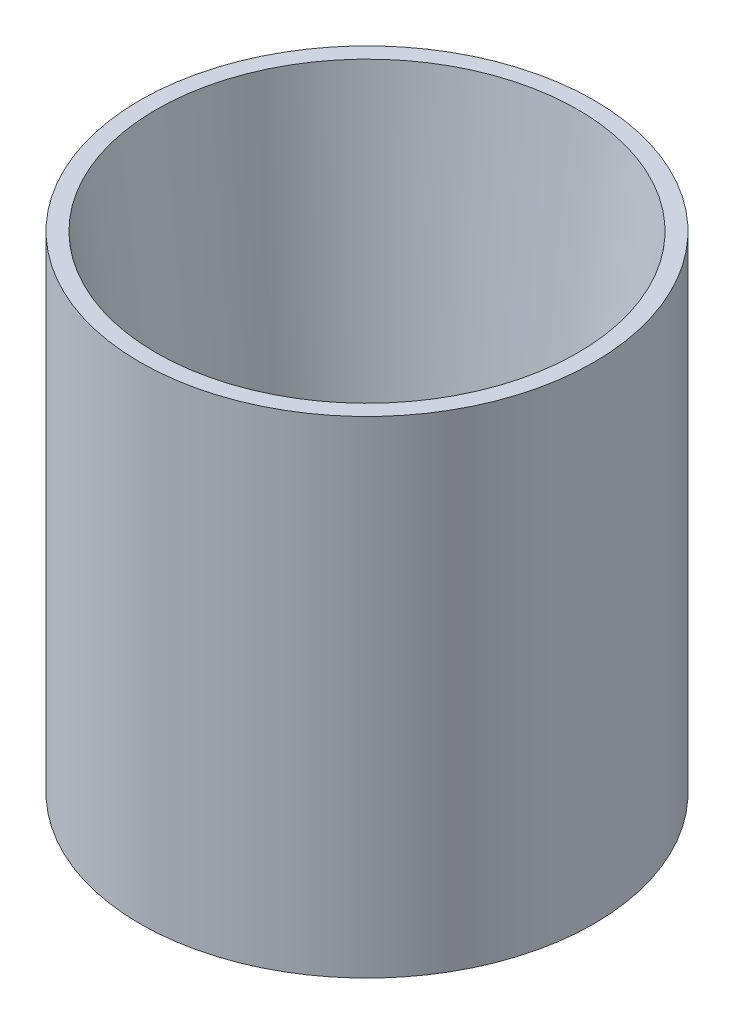
ISO-10303-21;
HEADER;
FILE_DESCRIPTION(('STEP AP214'),'2;1');
FILE_NAME('part.step','',(''),(''),'','','');
FILE_SCHEMA(('AUTOMOTIVE_DESIGN { 1 0 10303 214 1 1 1 1 }'));
ENDSEC;
DATA;
#1=APPLICATION_CONTEXT('core data for automotive mechanical design processes');
#2=APPLICATION_PROTOCOL_DEFINITION('international standard','automotive_design',2000,#1);
#3=PRODUCT_CONTEXT('',#1,'mechanical');
#4=PRODUCT('Part','Part','',(#3));
#5=PRODUCT_RELATED_PRODUCT_CATEGORY('part','',(#4));
#6=PRODUCT_DEFINITION_FORMATION('','',#4);
#7=PRODUCT_DEFINITION_CONTEXT('part definition',#1,'design');
#8=PRODUCT_DEFINITION('design','',#6,#7);
#9=PRODUCT_DEFINITION_SHAPE('','',#8);
#10=(LENGTH_UNIT() NAMED_UNIT(*) SI_UNIT(.MILLI.,.METRE.));
#11=(NAMED_UNIT(*) PLANE_ANGLE_UNIT() SI_UNIT($,.RADIAN.));
#12=(NAMED_UNIT(*) SI_UNIT($,.STERADIAN.) SOLID_ANGLE_UNIT());
#13=UNCERTAINTY_MEASURE_WITH_UNIT(LENGTH_MEASURE(1.E-05),#10,'distance_accuracy_value','');
#14=(GEOMETRIC_REPRESENTATION_CONTEXT(3) GLOBAL_UNCERTAINTY_ASSIGNED_CONTEXT((#13)) GLOBAL_UNIT_ASSIGNED_CONTEXT((#10,
#11,#12)) REPRESENTATION_CONTEXT('',''));
#15=CARTESIAN_POINT('',(0.,0.,0.));
#16=DIRECTION('',(0.,0.,1.));
#17=DIRECTION('',(1.,0.,0.));
#18=AXIS2_PLACEMENT_3D('',#15,#16,#17);
#19=CARTESIAN_POINT('',(-14.7970969503537,-16.1451612903226,0.));
#20=DIRECTION('',(0.,1.,0.));
#21=DIRECTION('',(0.,0.,1.));
#22=AXIS2_PLACEMENT_3D('',#19,#20,#21);
#23=CONICAL_SURFACE('',#22,4.91810189008461,0.108666663290719);
#24=CARTESIAN_POINT('',(-14.7970969503537,-1.6451612903226,0.));
#25=DIRECTION('',(0.,1.,0.));
#26=DIRECTION('',(0.,0.,1.));
#27=AXIS2_PLACEMENT_3D('',#24,#25,#26);
#28=CIRCLE('',#27,6.5);
#29=CARTESIAN_POINT('',(-14.7970969503537,-1.6451612903226,6.5));
#30=VERTEX_POINT('',#29);
#31=EDGE_CURVE('E66',#30,#30,#28,.T.);
#32=ORIENTED_EDGE('',*,*,#31,.T.);
#33=EDGE_LOOP('',(#32));
#34=FACE_BOUND('',#33,.T.);
#35=CARTESIAN_POINT('',(-14.7970969503537,-16.1451612903226,0.));
#36=DIRECTION('',(0.,1.,0.));
#37=DIRECTION('',(0.,0.,1.));
#38=AXIS2_PLACEMENT_3D('',#35,#36,#37);
#39=CIRCLE('',#38,4.91810189008461);
#40=CARTESIAN_POINT('',(-14.7970969503537,-16.1451612903226,4.91810189008461));
#41=VERTEX_POINT('',#40);
#42=EDGE_CURVE('E10',#41,#41,#39,.T.);
#43=ORIENTED_EDGE('',*,*,#42,.F.);
#44=EDGE_LOOP('',(#43));
#45=FACE_BOUND('',#44,.T.);
#46=ADVANCED_FACE('F43',(#34,#45),#23,.F.);
#47=CARTESIAN_POINT('',(-14.7970969503537,26.4248387096774,0.));
#48=DIRECTION('',(0.,1.,0.));
#49=DIRECTION('',(0.,0.,1.));
#50=AXIS2_PLACEMENT_3D('',#47,#48,#49);
#51=CYLINDRICAL_SURFACE('',#50,4.91810189008461);
#52=ORIENTED_EDGE('',*,*,#42,.T.);
#53=EDGE_LOOP('',(#52));
#54=FACE_BOUND('',#53,.T.);
#55=CARTESIAN_POINT('',(-14.7970969503537,-16.6451612903226,0.));
#56=DIRECTION('',(0.,1.,0.));
#57=DIRECTION('',(0.,0.,1.));
#58=AXIS2_PLACEMENT_3D('',#55,#56,#57);
#59=CIRCLE('',#58,4.91810189008461);
#60=CARTESIAN_POINT('',(-14.7970969503537,-16.6451612903226,4.91810189008461));
#61=VERTEX_POINT('',#60);
#62=EDGE_CURVE('E50',#61,#61,#59,.T.);
#63=ORIENTED_EDGE('',*,*,#62,.F.);
#64=EDGE_LOOP('',(#63));
#65=FACE_BOUND('',#64,.T.);
#66=ADVANCED_FACE('F85',(#54,#65),#51,.F.);
#67=CARTESIAN_POINT('',(-19.7151988404383,-16.6451612903226,0.));
#68=DIRECTION('',(0.,-1.,0.));
#69=DIRECTION('',(0.,0.,-1.));
#70=AXIS2_PLACEMENT_3D('',#67,#68,#69);
#71=PLANE('',#70);
#72=ORIENTED_EDGE('',*,*,#62,.T.);
#73=EDGE_LOOP('',(#72));
#74=FACE_BOUND('',#73,.T.);
#75=CARTESIAN_POINT('',(-14.7970969503537,-16.6451612903226,0.));
#76=DIRECTION('',(0.,1.,0.));
#77=DIRECTION('',(0.,0.,1.));
#78=AXIS2_PLACEMENT_3D('',#75,#76,#77);
#79=CIRCLE('',#78,7.);
#80=CARTESIAN_POINT('',(-14.7970969503537,-16.6451612903226,7.));
#81=VERTEX_POINT('',#80);
#82=EDGE_CURVE('E55',#81,#81,#79,.T.);
#83=ORIENTED_EDGE('',*,*,#82,.F.);
#84=EDGE_LOOP('',(#83));
#85=FACE_BOUND('',#84,.T.);
#86=ADVANCED_FACE('F81',(#74,#85),#71,.T.);
#87=CARTESIAN_POINT('',(-14.7970969503537,26.4248387096774,0.));
#88=DIRECTION('',(0.,1.,0.));
#89=DIRECTION('',(0.,0.,1.));
#90=AXIS2_PLACEMENT_3D('',#87,#88,#89);
#91=CYLINDRICAL_SURFACE('',#90,7.);
#92=ORIENTED_EDGE('',*,*,#82,.T.);
#93=EDGE_LOOP('',(#92));
#94=FACE_BOUND('',#93,.T.);
#95=CARTESIAN_POINT('',(-14.7970969503537,-1.6451612903226,0.));
#96=DIRECTION('',(0.,1.,0.));
#97=DIRECTION('',(0.,0.,1.));
#98=AXIS2_PLACEMENT_3D('',#95,#96,#97);
#99=CIRCLE('',#98,7.);
#100=CARTESIAN_POINT('',(-14.7970969503537,-1.6451612903226,7.));
#101=VERTEX_POINT('',#100);
#102=EDGE_CURVE('E60',#101,#101,#99,.T.);
#103=ORIENTED_EDGE('',*,*,#102,.F.);
#104=EDGE_LOOP('',(#103));
#105=FACE_BOUND('',#104,.T.);
#106=ADVANCED_FACE('F75',(#94,#105),#91,.T.);
#107=CARTESIAN_POINT('',(-21.7970969503537,-1.6451612903226,0.));
#108=DIRECTION('',(0.,1.,0.));
#109=DIRECTION('',(0.,0.,1.));
#110=AXIS2_PLACEMENT_3D('',#107,#108,#109);
#111=PLANE('',#110);
#112=ORIENTED_EDGE('',*,*,#102,.T.);
#113=EDGE_LOOP('',(#112));
#114=FACE_BOUND('',#113,.T.);
#115=ORIENTED_EDGE('',*,*,#31,.F.);
#116=EDGE_LOOP('',(#115));
#117=FACE_BOUND('',#116,.T.);
#118=ADVANCED_FACE('F73',(#114,#117),#111,.T.);
#119=CLOSED_SHELL('',(#46,#66,#86,#106,#118));
#120=MANIFOLD_SOLID_BREP('B2',#119);
#121=ADVANCED_BREP_SHAPE_REPRESENTATION('',(#18,#120),#14);
#122=SHAPE_DEFINITION_REPRESENTATION(#9,#121);
ENDSEC;
END-ISO-10303-21;
